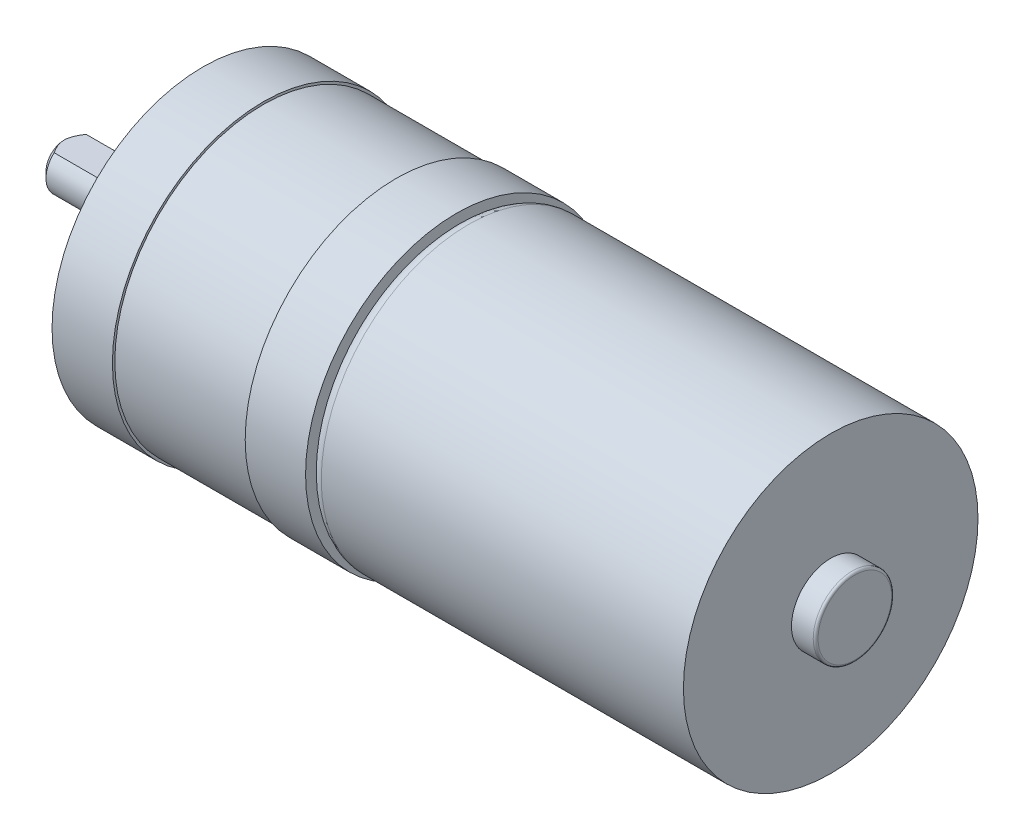
ISO-10303-21;
HEADER;
FILE_DESCRIPTION(('STEP AP214'),'2;1');
FILE_NAME('part.step','',(''),(''),'','','');
FILE_SCHEMA(('AUTOMOTIVE_DESIGN { 1 0 10303 214 1 1 1 1 }'));
ENDSEC;
DATA;
#1=APPLICATION_CONTEXT('core data for automotive mechanical design processes');
#2=APPLICATION_PROTOCOL_DEFINITION('international standard','automotive_design',2000,#1);
#3=PRODUCT_CONTEXT('',#1,'mechanical');
#4=PRODUCT('Part','Part','',(#3));
#5=PRODUCT_RELATED_PRODUCT_CATEGORY('part','',(#4));
#6=PRODUCT_DEFINITION_FORMATION('','',#4);
#7=PRODUCT_DEFINITION_CONTEXT('part definition',#1,'design');
#8=PRODUCT_DEFINITION('design','',#6,#7);
#9=PRODUCT_DEFINITION_SHAPE('','',#8);
#10=(LENGTH_UNIT() NAMED_UNIT(*) SI_UNIT(.MILLI.,.METRE.));
#11=(NAMED_UNIT(*) PLANE_ANGLE_UNIT() SI_UNIT($,.RADIAN.));
#12=(NAMED_UNIT(*) SI_UNIT($,.STERADIAN.) SOLID_ANGLE_UNIT());
#13=UNCERTAINTY_MEASURE_WITH_UNIT(LENGTH_MEASURE(1.E-05),#10,'distance_accuracy_value','');
#14=(GEOMETRIC_REPRESENTATION_CONTEXT(3) GLOBAL_UNCERTAINTY_ASSIGNED_CONTEXT((#13)) GLOBAL_UNIT_ASSIGNED_CONTEXT((#10,
#11,#12)) REPRESENTATION_CONTEXT('',''));
#15=CARTESIAN_POINT('',(0.,0.,0.));
#16=DIRECTION('',(0.,0.,1.));
#17=DIRECTION('',(1.,0.,0.));
#18=AXIS2_PLACEMENT_3D('',#15,#16,#17);
#19=CARTESIAN_POINT('',(-21.4466609261385,0.,0.));
#20=DIRECTION('',(-1.,0.,0.));
#21=DIRECTION('',(0.,0.,1.));
#22=AXIS2_PLACEMENT_3D('',#19,#20,#21);
#23=CYLINDRICAL_SURFACE('',#22,12.5);
#24=CARTESIAN_POINT('',(-4.94666092613853,0.,0.));
#25=DIRECTION('',(-1.,0.,0.));
#26=DIRECTION('',(0.,0.,1.));
#27=AXIS2_PLACEMENT_3D('',#24,#25,#26);
#28=CIRCLE('',#27,12.5);
#29=CARTESIAN_POINT('',(-4.94666092613853,0.,12.5));
#30=VERTEX_POINT('',#29);
#31=EDGE_CURVE('E89',#30,#30,#28,.T.);
#32=ORIENTED_EDGE('',*,*,#31,.T.);
#33=EDGE_LOOP('',(#32));
#34=FACE_BOUND('',#33,.T.);
#35=CARTESIAN_POINT('',(-9.94666092613853,0.,0.));
#36=DIRECTION('',(-1.,0.,0.));
#37=DIRECTION('',(0.,0.,1.));
#38=AXIS2_PLACEMENT_3D('',#35,#36,#37);
#39=CIRCLE('',#38,12.5);
#40=CARTESIAN_POINT('',(-9.94666092613853,0.,12.5));
#41=VERTEX_POINT('',#40);
#42=EDGE_CURVE('E11',#41,#41,#39,.T.);
#43=ORIENTED_EDGE('',*,*,#42,.F.);
#44=EDGE_LOOP('',(#43));
#45=FACE_BOUND('',#44,.T.);
#46=ADVANCED_FACE('F34',(#34,#45),#23,.T.);
#47=CARTESIAN_POINT('',(-9.94666092613853,-3.53165151629512,0.));
#48=DIRECTION('',(-1.,0.,0.));
#49=DIRECTION('',(0.,0.,1.));
#50=AXIS2_PLACEMENT_3D('',#47,#48,#49);
#51=PLANE('',#50);
#52=ORIENTED_EDGE('',*,*,#42,.T.);
#53=EDGE_LOOP('',(#52));
#54=FACE_BOUND('',#53,.T.);
#55=CARTESIAN_POINT('',(-9.94666092613853,0.,0.));
#56=DIRECTION('',(-1.,0.,0.));
#57=DIRECTION('',(0.,0.,1.));
#58=AXIS2_PLACEMENT_3D('',#55,#56,#57);
#59=CIRCLE('',#58,3.53165151629512);
#60=CARTESIAN_POINT('',(-9.94666092613853,0.,3.53165151629512));
#61=VERTEX_POINT('',#60);
#62=EDGE_CURVE('E41',#61,#61,#59,.T.);
#63=ORIENTED_EDGE('',*,*,#62,.F.);
#64=EDGE_LOOP('',(#63));
#65=FACE_BOUND('',#64,.T.);
#66=ADVANCED_FACE('F151',(#54,#65),#51,.T.);
#67=CARTESIAN_POINT('',(-21.4466609261385,0.,0.));
#68=DIRECTION('',(-1.,0.,0.));
#69=DIRECTION('',(0.,0.,1.));
#70=AXIS2_PLACEMENT_3D('',#67,#68,#69);
#71=CYLINDRICAL_SURFACE('',#70,3.53165151629512);
#72=ORIENTED_EDGE('',*,*,#62,.T.);
#73=EDGE_LOOP('',(#72));
#74=FACE_BOUND('',#73,.T.);
#75=CARTESIAN_POINT('',(-12.4466609261385,0.,0.));
#76=DIRECTION('',(-1.,0.,0.));
#77=DIRECTION('',(0.,0.,1.));
#78=AXIS2_PLACEMENT_3D('',#75,#76,#77);
#79=CIRCLE('',#78,3.53165151629512);
#80=CARTESIAN_POINT('',(-12.4466609261385,0.,3.53165151629512));
#81=VERTEX_POINT('',#80);
#82=EDGE_CURVE('E166',#81,#81,#79,.T.);
#83=ORIENTED_EDGE('',*,*,#82,.F.);
#84=EDGE_LOOP('',(#83));
#85=FACE_BOUND('',#84,.T.);
#86=ADVANCED_FACE('F156',(#74,#85),#71,.T.);
#87=CARTESIAN_POINT('',(-12.4466609261385,-2.,0.));
#88=DIRECTION('',(-1.,0.,0.));
#89=DIRECTION('',(0.,0.,1.));
#90=AXIS2_PLACEMENT_3D('',#87,#88,#89);
#91=PLANE('',#90);
#92=ORIENTED_EDGE('',*,*,#82,.T.);
#93=EDGE_LOOP('',(#92));
#94=FACE_BOUND('',#93,.T.);
#95=CARTESIAN_POINT('',(-12.4466609261385,0.,0.));
#96=DIRECTION('',(-1.,0.,0.));
#97=DIRECTION('',(0.,0.,1.));
#98=AXIS2_PLACEMENT_3D('',#95,#96,#97);
#99=CIRCLE('',#98,2.);
#100=CARTESIAN_POINT('',(-12.4466609261385,0.,2.));
#101=VERTEX_POINT('',#100);
#102=EDGE_CURVE('E168',#101,#101,#99,.T.);
#103=ORIENTED_EDGE('',*,*,#102,.F.);
#104=EDGE_LOOP('',(#103));
#105=FACE_BOUND('',#104,.T.);
#106=ADVANCED_FACE('F227',(#94,#105),#91,.T.);
#107=CARTESIAN_POINT('',(-21.4466609261385,0.,0.));
#108=DIRECTION('',(-1.,0.,0.));
#109=DIRECTION('',(0.,0.,1.));
#110=AXIS2_PLACEMENT_3D('',#107,#108,#109);
#111=CYLINDRICAL_SURFACE('',#110,2.);
#112=DIRECTION('',(-1.,0.,0.));
#113=VECTOR('',#112,1.);
#114=CARTESIAN_POINT('',(-13.4466609261385,1.5,1.3228756555323));
#115=LINE('',#114,#113);
#116=CARTESIAN_POINT('',(-13.4466609261385,1.5,1.3228756555323));
#117=VERTEX_POINT('',#116);
#118=CARTESIAN_POINT('',(-20.9466609261385,1.5,1.3228756555323));
#119=VERTEX_POINT('',#118);
#120=EDGE_CURVE('E72',#117,#119,#115,.T.);
#121=ORIENTED_EDGE('',*,*,#120,.T.);
#122=CARTESIAN_POINT('',(-20.9466609261385,0.,0.));
#123=DIRECTION('',(-1.,0.,0.));
#124=DIRECTION('',(0.,0.,1.));
#125=AXIS2_PLACEMENT_3D('',#122,#123,#124);
#126=CIRCLE('',#125,2.);
#127=CARTESIAN_POINT('',(-20.9466609261385,1.5,-1.3228756555323));
#128=VERTEX_POINT('',#127);
#129=EDGE_CURVE('E78',#128,#119,#126,.T.);
#130=ORIENTED_EDGE('',*,*,#129,.F.);
#131=DIRECTION('',(-1.,0.,0.));
#132=VECTOR('',#131,1.);
#133=CARTESIAN_POINT('',(-13.4466609261385,1.5,-1.3228756555323));
#134=LINE('',#133,#132);
#135=CARTESIAN_POINT('',(-13.4466609261385,1.5,-1.3228756555323));
#136=VERTEX_POINT('',#135);
#137=EDGE_CURVE('E71',#136,#128,#134,.T.);
#138=ORIENTED_EDGE('',*,*,#137,.F.);
#139=CARTESIAN_POINT('',(-13.4466609261385,0.,0.));
#140=DIRECTION('',(-1.,0.,0.));
#141=DIRECTION('',(0.,0.,1.));
#142=AXIS2_PLACEMENT_3D('',#139,#140,#141);
#143=CIRCLE('',#142,2.);
#144=EDGE_CURVE('E63',#117,#136,#143,.T.);
#145=ORIENTED_EDGE('',*,*,#144,.F.);
#146=EDGE_LOOP('',(#121,#130,#138,#145));
#147=FACE_BOUND('',#146,.T.);
#148=ORIENTED_EDGE('',*,*,#102,.T.);
#149=EDGE_LOOP('',(#148));
#150=FACE_BOUND('',#149,.T.);
#151=ADVANCED_FACE('F75',(#147,#150),#111,.T.);
#152=CARTESIAN_POINT('',(-21.4466609261385,0.,0.));
#153=DIRECTION('',(1.,0.,0.));
#154=DIRECTION('',(0.,0.,-1.));
#155=AXIS2_PLACEMENT_3D('',#152,#153,#154);
#156=CONICAL_SURFACE('',#155,1.5,0.785398163397448);
#157=CARTESIAN_POINT('',(-18.6599944301756,1.5,-4.01565805909955));
#158=CARTESIAN_POINT('',(-18.7772799339824,1.5,-3.89042013528773));
#159=CARTESIAN_POINT('',(-18.8942447324204,1.5,-3.76487746263411));
#160=CARTESIAN_POINT('',(-19.1272488522695,1.5,-3.51287496184868));
#161=CARTESIAN_POINT('',(-19.2432879191972,1.5,-3.38641489861014));
#162=CARTESIAN_POINT('',(-19.4750754185143,1.5,-3.13125567201492));
#163=CARTESIAN_POINT('',(-19.5908129825144,1.5,-3.00254661249287));
#164=CARTESIAN_POINT('',(-19.8204354842027,1.5,-2.74351946624489));
#165=CARTESIAN_POINT('',(-19.9343207337169,1.5,-2.61320165697772));
#166=CARTESIAN_POINT('',(-20.1398631331694,1.5,-2.37303010342155));
#167=CARTESIAN_POINT('',(-20.2319504655065,1.5,-2.26354611208234));
#168=CARTESIAN_POINT('',(-20.4134720299847,1.5,-2.04231590010789));
#169=CARTESIAN_POINT('',(-20.502905132972,1.5,-1.93056874975612));
#170=CARTESIAN_POINT('',(-20.6775427183617,1.5,-1.70415010582334));
#171=CARTESIAN_POINT('',(-20.7627558893309,1.5,-1.58948542537739));
#172=CARTESIAN_POINT('',(-20.8856244023833,1.5,-1.41406690474835));
#173=CARTESIAN_POINT('',(-20.9257433465697,1.5,-1.3550432048692));
#174=CARTESIAN_POINT('',(-21.0038206647526,1.5,-1.23558919260889));
#175=CARTESIAN_POINT('',(-21.0417794769346,1.5,-1.17515916903174));
#176=CARTESIAN_POINT('',(-21.1079330584043,1.5,-1.06419326243409));
#177=CARTESIAN_POINT('',(-21.1366159684713,1.5,-1.01394977892618));
#178=CARTESIAN_POINT('',(-21.1916094275951,1.5,-0.912163598634599));
#179=CARTESIAN_POINT('',(-21.2179196718334,1.5,-0.860620736003789));
#180=CARTESIAN_POINT('',(-21.2674843606524,1.5,-0.75613647512261));
#181=CARTESIAN_POINT('',(-21.2907422542188,1.5,-0.703196737968753));
#182=CARTESIAN_POINT('',(-21.3334168644819,1.5,-0.595812489744645));
#183=CARTESIAN_POINT('',(-21.3528347074981,1.5,-0.54136842526216));
#184=CARTESIAN_POINT('',(-21.3965857411879,1.5,-0.399362441578788));
#185=CARTESIAN_POINT('',(-21.4174026018075,1.5,-0.310627728461867));
#186=CARTESIAN_POINT('',(-21.4370271007536,1.5,-0.17600485397584));
#187=CARTESIAN_POINT('',(-21.4416363946779,1.5,-0.130926602570022));
#188=CARTESIAN_POINT('',(-21.4467900111874,1.5,-0.0405278937250137));
#189=CARTESIAN_POINT('',(-21.4473344618416,1.5,0.00479255603833192));
#190=CARTESIAN_POINT('',(-21.4443171872065,1.5,0.0953274395539691));
#191=CARTESIAN_POINT('',(-21.4407522873543,1.5,0.140541764268593));
#192=CARTESIAN_POINT('',(-21.4297122542497,1.5,0.230492359752381));
#193=CARTESIAN_POINT('',(-21.422236332384,1.5,0.275228532250461));
#194=CARTESIAN_POINT('',(-21.4037214360982,1.5,0.364085515861556));
#195=CARTESIAN_POINT('',(-21.3926720005498,1.5,0.408204118547307));
#196=CARTESIAN_POINT('',(-21.3674809164456,1.5,0.495536760983926));
#197=CARTESIAN_POINT('',(-21.35333922587,1.5,0.538750788434028));
#198=CARTESIAN_POINT('',(-21.3010753758268,1.5,0.683373717402224));
#199=CARTESIAN_POINT('',(-21.2568457909961,1.5,0.782575044372217));
#200=CARTESIAN_POINT('',(-21.1589248993358,1.5,0.976220616942044));
#201=CARTESIAN_POINT('',(-21.1052128657479,1.5,1.07065384672911));
#202=CARTESIAN_POINT('',(-20.9910249681587,1.5,1.25697315171939));
#203=CARTESIAN_POINT('',(-20.9304707236246,1.5,1.34881059342671));
#204=CARTESIAN_POINT('',(-20.8053465362851,1.5,1.52952998233961));
#205=CARTESIAN_POINT('',(-20.7407807001573,1.5,1.61841481358109));
#206=CARTESIAN_POINT('',(-20.5957213813144,1.5,1.81156206065232));
#207=CARTESIAN_POINT('',(-20.5146162537708,1.5,1.91536246677856));
#208=CARTESIAN_POINT('',(-20.3497178302725,1.5,2.12081369094374));
#209=CARTESIAN_POINT('',(-20.265924131741,1.5,2.2224641832459));
#210=CARTESIAN_POINT('',(-20.0963751354204,1.5,2.42427777545712));
#211=CARTESIAN_POINT('',(-20.0106180247746,1.5,2.52443934729585));
#212=CARTESIAN_POINT('',(-19.8377347485601,1.5,2.72357467383111));
#213=CARTESIAN_POINT('',(-19.7506085499926,1.5,2.82254839979564));
#214=CARTESIAN_POINT('',(-19.5806572523155,1.5,3.01359651876727));
#215=CARTESIAN_POINT('',(-19.4978925037317,1.5,3.10572469788864));
#216=CARTESIAN_POINT('',(-19.3316557364276,1.5,3.289343530319));
#217=CARTESIAN_POINT('',(-19.2481837030317,1.5,3.38083417032726));
#218=CARTESIAN_POINT('',(-19.0808466594457,1.5,3.56312044751085));
#219=CARTESIAN_POINT('',(-18.996982758081,1.5,3.65391710371256));
#220=CARTESIAN_POINT('',(-18.8288030047615,1.5,3.83508406846687));
#221=CARTESIAN_POINT('',(-18.7444871715748,1.5,3.92545439443569));
#222=CARTESIAN_POINT('',(-18.6599944301756,1.5,4.01565805909955));
#223=B_SPLINE_CURVE_WITH_KNOTS('',3,(#157,#158,#159,#160,#161,#162,#163,#164,#165,#166,#167,
#168,#169,#170,#171,#172,#173,#174,#175,#176,#177,#178,#179,#180,#181,#182,#183,#184,#185,#186,
#187,#188,#189,#190,#191,#192,#193,#194,#195,#196,#197,#198,#199,#200,#201,#202,#203,#204,#205,
#206,#207,#208,#209,#210,#211,#212,#213,#214,#215,#216,#217,#218,#219,#220,#221,#222),
.UNSPECIFIED.,.F.,.F.,(4,2,2,2,2,2,2,2,2,2,2,2,2,2,2,2,2,2,2,2,2,2,2,2,2,2,2,2,2,2,2,2,4),(0.,
0.514750699468764,1.02963833852691,1.54890574576718,2.06808481331768,2.49724068126467,
2.92657657581786,3.35498823243659,3.56905741024268,3.78308300790428,3.95659551745444,
4.13013028665268,4.30346725130455,4.47675329909123,4.74890512459737,4.8846880297537,
5.02046665684716,5.15635024622355,5.2922612455528,5.42857376872477,5.5648881443249,
5.88980547741524,6.2154420130272,6.54528321670252,6.87479215354149,7.2699099426123,
7.66508717383951,8.06064529972853,8.45621297429788,8.82774376861426,9.19928229096719,
9.57008337714151,9.94086918203867),.UNSPECIFIED.);
#224=CARTESIAN_POINT('',(-21.4466609261385,1.5,0.));
#225=VERTEX_POINT('',#224);
#226=EDGE_CURVE('E48',#128,#225,#223,.T.);
#227=ORIENTED_EDGE('',*,*,#226,.F.);
#228=ORIENTED_EDGE('',*,*,#129,.T.);
#229=EDGE_CURVE('E52',#225,#119,#223,.T.);
#230=ORIENTED_EDGE('',*,*,#229,.F.);
#231=CARTESIAN_POINT('',(-21.4466609261385,0.,0.));
#232=DIRECTION('',(-1.,0.,0.));
#233=DIRECTION('',(0.,0.,1.));
#234=AXIS2_PLACEMENT_3D('',#231,#232,#233);
#235=CIRCLE('',#234,1.5);
#236=EDGE_CURVE('E174',#225,#225,#235,.T.);
#237=ORIENTED_EDGE('',*,*,#236,.F.);
#238=EDGE_LOOP('',(#227,#228,#230,#237));
#239=FACE_BOUND('',#238,.T.);
#240=ADVANCED_FACE('F91',(#239),#156,.T.);
#241=CARTESIAN_POINT('',(-21.4466609261385,0.,0.));
#242=DIRECTION('',(-1.,0.,0.));
#243=DIRECTION('',(0.,0.,1.));
#244=AXIS2_PLACEMENT_3D('',#241,#242,#243);
#245=PLANE('',#244);
#246=ORIENTED_EDGE('',*,*,#236,.T.);
#247=EDGE_LOOP('',(#246));
#248=FACE_BOUND('',#247,.T.);
#249=ADVANCED_FACE('F141',(#248),#245,.T.);
#250=CARTESIAN_POINT('',(44.0533390738615,-3.05,0.));
#251=DIRECTION('',(1.,0.,0.));
#252=DIRECTION('',(0.,0.,-1.));
#253=AXIS2_PLACEMENT_3D('',#250,#251,#252);
#254=PLANE('',#253);
#255=CARTESIAN_POINT('',(44.0533390738615,0.,0.));
#256=DIRECTION('',(-1.,0.,0.));
#257=DIRECTION('',(0.,0.,1.));
#258=AXIS2_PLACEMENT_3D('',#255,#256,#257);
#259=CIRCLE('',#258,3.05);
#260=CARTESIAN_POINT('',(44.0533390738615,0.,3.05));
#261=VERTEX_POINT('',#260);
#262=EDGE_CURVE('E176',#261,#261,#259,.T.);
#263=ORIENTED_EDGE('',*,*,#262,.F.);
#264=EDGE_LOOP('',(#263));
#265=FACE_BOUND('',#264,.T.);
#266=ADVANCED_FACE('F138',(#265),#254,.T.);
#267=CARTESIAN_POINT('',(43.8533390738615,0.,0.));
#268=DIRECTION('',(-1.,0.,0.));
#269=DIRECTION('',(0.,0.,1.));
#270=AXIS2_PLACEMENT_3D('',#267,#268,#269);
#271=TOROIDAL_SURFACE('',#270,3.05,0.199999999999999);
#272=ORIENTED_EDGE('',*,*,#262,.T.);
#273=EDGE_LOOP('',(#272));
#274=FACE_BOUND('',#273,.T.);
#275=CARTESIAN_POINT('',(43.8533390738615,0.,0.));
#276=DIRECTION('',(-1.,0.,0.));
#277=DIRECTION('',(0.,0.,1.));
#278=AXIS2_PLACEMENT_3D('',#275,#276,#277);
#279=CIRCLE('',#278,3.25);
#280=CARTESIAN_POINT('',(43.8533390738615,0.,3.25));
#281=VERTEX_POINT('',#280);
#282=EDGE_CURVE('E179',#281,#281,#279,.T.);
#283=ORIENTED_EDGE('',*,*,#282,.F.);
#284=EDGE_LOOP('',(#283));
#285=FACE_BOUND('',#284,.T.);
#286=ADVANCED_FACE('F134',(#274,#285),#271,.T.);
#287=CARTESIAN_POINT('',(-21.4466609261385,0.,0.));
#288=DIRECTION('',(-1.,0.,0.));
#289=DIRECTION('',(0.,0.,1.));
#290=AXIS2_PLACEMENT_3D('',#287,#288,#289);
#291=CYLINDRICAL_SURFACE('',#290,3.25);
#292=ORIENTED_EDGE('',*,*,#282,.T.);
#293=EDGE_LOOP('',(#292));
#294=FACE_BOUND('',#293,.T.);
#295=CARTESIAN_POINT('',(42.0533390738615,0.,0.));
#296=DIRECTION('',(-1.,0.,0.));
#297=DIRECTION('',(0.,0.,1.));
#298=AXIS2_PLACEMENT_3D('',#295,#296,#297);
#299=CIRCLE('',#298,3.25);
#300=CARTESIAN_POINT('',(42.0533390738615,0.,3.25));
#301=VERTEX_POINT('',#300);
#302=EDGE_CURVE('E182',#301,#301,#299,.T.);
#303=ORIENTED_EDGE('',*,*,#302,.F.);
#304=EDGE_LOOP('',(#303));
#305=FACE_BOUND('',#304,.T.);
#306=ADVANCED_FACE('F130',(#294,#305),#291,.T.);
#307=CARTESIAN_POINT('',(42.0533390738615,-12.2,0.));
#308=DIRECTION('',(1.,0.,0.));
#309=DIRECTION('',(0.,0.,-1.));
#310=AXIS2_PLACEMENT_3D('',#307,#308,#309);
#311=PLANE('',#310);
#312=ORIENTED_EDGE('',*,*,#302,.T.);
#313=EDGE_LOOP('',(#312));
#314=FACE_BOUND('',#313,.T.);
#315=CARTESIAN_POINT('',(42.0533390738615,0.,0.));
#316=DIRECTION('',(-1.,0.,0.));
#317=DIRECTION('',(0.,0.,1.));
#318=AXIS2_PLACEMENT_3D('',#315,#316,#317);
#319=CIRCLE('',#318,12.2);
#320=CARTESIAN_POINT('',(42.0533390738615,0.,12.2));
#321=VERTEX_POINT('',#320);
#322=EDGE_CURVE('E185',#321,#321,#319,.T.);
#323=ORIENTED_EDGE('',*,*,#322,.F.);
#324=EDGE_LOOP('',(#323));
#325=FACE_BOUND('',#324,.T.);
#326=ADVANCED_FACE('F126',(#314,#325),#311,.T.);
#327=CARTESIAN_POINT('',(-21.4466609261385,0.,0.));
#328=DIRECTION('',(-1.,0.,0.));
#329=DIRECTION('',(0.,0.,1.));
#330=AXIS2_PLACEMENT_3D('',#327,#328,#329);
#331=CYLINDRICAL_SURFACE('',#330,12.2);
#332=ORIENTED_EDGE('',*,*,#322,.T.);
#333=EDGE_LOOP('',(#332));
#334=FACE_BOUND('',#333,.T.);
#335=CARTESIAN_POINT('',(12.0533390738614,0.,0.));
#336=DIRECTION('',(-1.,0.,0.));
#337=DIRECTION('',(0.,0.,1.));
#338=AXIS2_PLACEMENT_3D('',#335,#336,#337);
#339=CIRCLE('',#338,12.2);
#340=CARTESIAN_POINT('',(12.0533390738614,0.,12.2));
#341=VERTEX_POINT('',#340);
#342=EDGE_CURVE('E188',#341,#341,#339,.T.);
#343=ORIENTED_EDGE('',*,*,#342,.F.);
#344=EDGE_LOOP('',(#343));
#345=FACE_BOUND('',#344,.T.);
#346=ADVANCED_FACE('F122',(#334,#345),#331,.T.);
#347=CARTESIAN_POINT('',(12.0533390738614,0.,0.));
#348=DIRECTION('',(-1.,0.,0.));
#349=DIRECTION('',(0.,0.,1.));
#350=AXIS2_PLACEMENT_3D('',#347,#348,#349);
#351=TOROIDAL_SURFACE('',#350,11.2,1.);
#352=ORIENTED_EDGE('',*,*,#342,.T.);
#353=EDGE_LOOP('',(#352));
#354=FACE_BOUND('',#353,.T.);
#355=CARTESIAN_POINT('',(11.0533390738614,0.,0.));
#356=DIRECTION('',(-1.,0.,0.));
#357=DIRECTION('',(0.,0.,1.));
#358=AXIS2_PLACEMENT_3D('',#355,#356,#357);
#359=CIRCLE('',#358,11.2);
#360=CARTESIAN_POINT('',(11.0533390738614,0.,11.2));
#361=VERTEX_POINT('',#360);
#362=EDGE_CURVE('E191',#361,#361,#359,.T.);
#363=ORIENTED_EDGE('',*,*,#362,.F.);
#364=EDGE_LOOP('',(#363));
#365=FACE_BOUND('',#364,.T.);
#366=ADVANCED_FACE('F118',(#354,#365),#351,.T.);
#367=CARTESIAN_POINT('',(11.0533390738615,-11.2,0.));
#368=DIRECTION('',(1.,0.,0.));
#369=DIRECTION('',(0.,0.,-1.));
#370=AXIS2_PLACEMENT_3D('',#367,#368,#369);
#371=PLANE('',#370);
#372=ORIENTED_EDGE('',*,*,#362,.T.);
#373=EDGE_LOOP('',(#372));
#374=FACE_BOUND('',#373,.T.);
#375=CARTESIAN_POINT('',(11.0533390738615,0.,0.));
#376=DIRECTION('',(-1.,0.,0.));
#377=DIRECTION('',(0.,0.,1.));
#378=AXIS2_PLACEMENT_3D('',#375,#376,#377);
#379=CIRCLE('',#378,12.5);
#380=CARTESIAN_POINT('',(11.0533390738615,0.,12.5));
#381=VERTEX_POINT('',#380);
#382=EDGE_CURVE('E194',#381,#381,#379,.T.);
#383=ORIENTED_EDGE('',*,*,#382,.F.);
#384=EDGE_LOOP('',(#383));
#385=FACE_BOUND('',#384,.T.);
#386=ADVANCED_FACE('F114',(#374,#385),#371,.T.);
#387=CARTESIAN_POINT('',(-21.4466609261385,0.,0.));
#388=DIRECTION('',(-1.,0.,0.));
#389=DIRECTION('',(0.,0.,1.));
#390=AXIS2_PLACEMENT_3D('',#387,#388,#389);
#391=CYLINDRICAL_SURFACE('',#390,12.5);
#392=ORIENTED_EDGE('',*,*,#382,.T.);
#393=EDGE_LOOP('',(#392));
#394=FACE_BOUND('',#393,.T.);
#395=CARTESIAN_POINT('',(6.05333907386146,0.,0.));
#396=DIRECTION('',(-1.,0.,0.));
#397=DIRECTION('',(0.,0.,1.));
#398=AXIS2_PLACEMENT_3D('',#395,#396,#397);
#399=CIRCLE('',#398,12.5);
#400=CARTESIAN_POINT('',(6.05333907386146,0.,12.5));
#401=VERTEX_POINT('',#400);
#402=EDGE_CURVE('E197',#401,#401,#399,.T.);
#403=ORIENTED_EDGE('',*,*,#402,.F.);
#404=EDGE_LOOP('',(#403));
#405=FACE_BOUND('',#404,.T.);
#406=ADVANCED_FACE('F110',(#394,#405),#391,.T.);
#407=CARTESIAN_POINT('',(6.05333907386146,-12.3,0.));
#408=DIRECTION('',(-1.,0.,0.));
#409=DIRECTION('',(0.,0.,1.));
#410=AXIS2_PLACEMENT_3D('',#407,#408,#409);
#411=PLANE('',#410);
#412=ORIENTED_EDGE('',*,*,#402,.T.);
#413=EDGE_LOOP('',(#412));
#414=FACE_BOUND('',#413,.T.);
#415=CARTESIAN_POINT('',(6.05333907386146,0.,0.));
#416=DIRECTION('',(-1.,0.,0.));
#417=DIRECTION('',(0.,0.,1.));
#418=AXIS2_PLACEMENT_3D('',#415,#416,#417);
#419=CIRCLE('',#418,12.3);
#420=CARTESIAN_POINT('',(6.05333907386146,0.,12.3));
#421=VERTEX_POINT('',#420);
#422=EDGE_CURVE('E200',#421,#421,#419,.T.);
#423=ORIENTED_EDGE('',*,*,#422,.F.);
#424=EDGE_LOOP('',(#423));
#425=FACE_BOUND('',#424,.T.);
#426=ADVANCED_FACE('F106',(#414,#425),#411,.T.);
#427=CARTESIAN_POINT('',(-21.4466609261385,0.,0.));
#428=DIRECTION('',(-1.,0.,0.));
#429=DIRECTION('',(0.,0.,1.));
#430=AXIS2_PLACEMENT_3D('',#427,#428,#429);
#431=CYLINDRICAL_SURFACE('',#430,12.3);
#432=ORIENTED_EDGE('',*,*,#422,.T.);
#433=EDGE_LOOP('',(#432));
#434=FACE_BOUND('',#433,.T.);
#435=CARTESIAN_POINT('',(-4.94666092613853,0.,0.));
#436=DIRECTION('',(-1.,0.,0.));
#437=DIRECTION('',(0.,0.,1.));
#438=AXIS2_PLACEMENT_3D('',#435,#436,#437);
#439=CIRCLE('',#438,12.3);
#440=CARTESIAN_POINT('',(-4.94666092613853,0.,12.3));
#441=VERTEX_POINT('',#440);
#442=EDGE_CURVE('E202',#441,#441,#439,.T.);
#443=ORIENTED_EDGE('',*,*,#442,.F.);
#444=EDGE_LOOP('',(#443));
#445=FACE_BOUND('',#444,.T.);
#446=ADVANCED_FACE('F102',(#434,#445),#431,.T.);
#447=CARTESIAN_POINT('',(-4.94666092613853,-12.3,0.));
#448=DIRECTION('',(1.,0.,0.));
#449=DIRECTION('',(0.,0.,-1.));
#450=AXIS2_PLACEMENT_3D('',#447,#448,#449);
#451=PLANE('',#450);
#452=ORIENTED_EDGE('',*,*,#442,.T.);
#453=EDGE_LOOP('',(#452));
#454=FACE_BOUND('',#453,.T.);
#455=ORIENTED_EDGE('',*,*,#31,.F.);
#456=EDGE_LOOP('',(#455));
#457=FACE_BOUND('',#456,.T.);
#458=ADVANCED_FACE('F99',(#454,#457),#451,.T.);
#459=CARTESIAN_POINT('',(-13.4466609261385,1.5,-1.3228756555323));
#460=DIRECTION('',(0.,-1.,0.));
#461=DIRECTION('',(0.,0.,-1.));
#462=AXIS2_PLACEMENT_3D('',#459,#460,#461);
#463=PLANE('',#462);
#464=ORIENTED_EDGE('',*,*,#226,.T.);
#465=ORIENTED_EDGE('',*,*,#229,.T.);
#466=ORIENTED_EDGE('',*,*,#120,.F.);
#467=DIRECTION('',(0.,0.,1.));
#468=VECTOR('',#467,1.);
#469=CARTESIAN_POINT('',(-13.4466609261385,1.5,-1.3228756555323));
#470=LINE('',#469,#468);
#471=EDGE_CURVE('E66',#136,#117,#470,.T.);
#472=ORIENTED_EDGE('',*,*,#471,.F.);
#473=ORIENTED_EDGE('',*,*,#137,.T.);
#474=EDGE_LOOP('',(#464,#465,#466,#472,#473));
#475=FACE_BOUND('',#474,.T.);
#476=ADVANCED_FACE('F70',(#475),#463,.F.);
#477=CARTESIAN_POINT('',(-13.4466609261385,0.,0.));
#478=DIRECTION('',(-1.,0.,0.));
#479=DIRECTION('',(0.,0.,1.));
#480=AXIS2_PLACEMENT_3D('',#477,#478,#479);
#481=PLANE('',#480);
#482=ORIENTED_EDGE('',*,*,#144,.T.);
#483=ORIENTED_EDGE('',*,*,#471,.T.);
#484=EDGE_LOOP('',(#482,#483));
#485=FACE_BOUND('',#484,.T.);
#486=ADVANCED_FACE('F65',(#485),#481,.T.);
#487=CLOSED_SHELL('',(#46,#66,#86,#106,#151,#240,#249,#266,#286,#306,#326,#346,#366,#386,#406,
#426,#446,#458,#476,#486));
#488=MANIFOLD_SOLID_BREP('B2',#487);
#489=ADVANCED_BREP_SHAPE_REPRESENTATION('',(#18,#488),#14);
#490=SHAPE_DEFINITION_REPRESENTATION(#9,#489);
ENDSEC;
END-ISO-10303-21;
